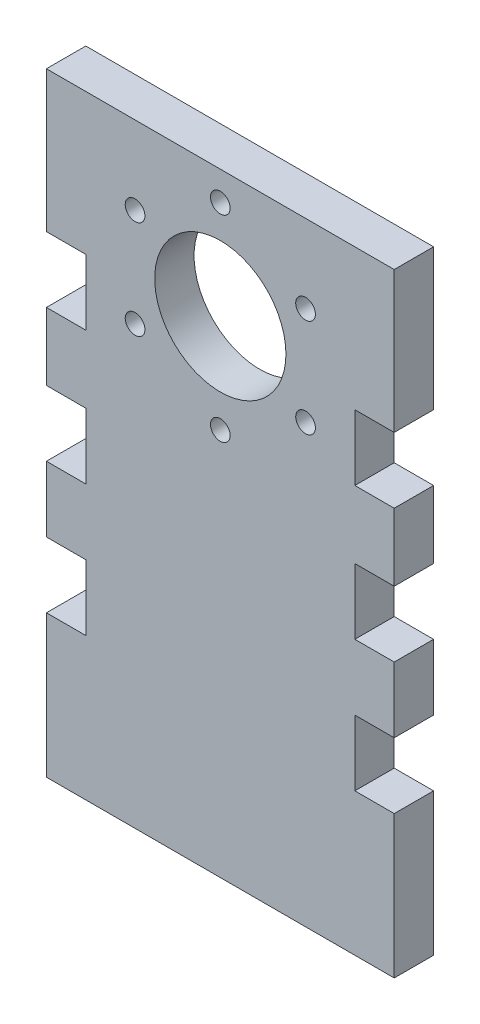
ISO-10303-21;
HEADER;
FILE_DESCRIPTION(('STEP AP214'),'2;1');
FILE_NAME('part.step','',(''),(''),'','','');
FILE_SCHEMA(('AUTOMOTIVE_DESIGN { 1 0 10303 214 1 1 1 1 }'));
ENDSEC;
DATA;
#1=APPLICATION_CONTEXT('core data for automotive mechanical design processes');
#2=APPLICATION_PROTOCOL_DEFINITION('international standard','automotive_design',2000,#1);
#3=PRODUCT_CONTEXT('',#1,'mechanical');
#4=PRODUCT('Part','Part','',(#3));
#5=PRODUCT_RELATED_PRODUCT_CATEGORY('part','',(#4));
#6=PRODUCT_DEFINITION_FORMATION('','',#4);
#7=PRODUCT_DEFINITION_CONTEXT('part definition',#1,'design');
#8=PRODUCT_DEFINITION('design','',#6,#7);
#9=PRODUCT_DEFINITION_SHAPE('','',#8);
#10=(LENGTH_UNIT() NAMED_UNIT(*) SI_UNIT(.MILLI.,.METRE.));
#11=(NAMED_UNIT(*) PLANE_ANGLE_UNIT() SI_UNIT($,.RADIAN.));
#12=(NAMED_UNIT(*) SI_UNIT($,.STERADIAN.) SOLID_ANGLE_UNIT());
#13=UNCERTAINTY_MEASURE_WITH_UNIT(LENGTH_MEASURE(1.E-05),#10,'distance_accuracy_value','');
#14=(GEOMETRIC_REPRESENTATION_CONTEXT(3) GLOBAL_UNCERTAINTY_ASSIGNED_CONTEXT((#13)) GLOBAL_UNIT_ASSIGNED_CONTEXT((#10,
#11,#12)) REPRESENTATION_CONTEXT('',''));
#15=CARTESIAN_POINT('',(0.,0.,0.));
#16=DIRECTION('',(0.,0.,1.));
#17=DIRECTION('',(1.,0.,0.));
#18=AXIS2_PLACEMENT_3D('',#15,#16,#17);
#19=CARTESIAN_POINT('',(0.,0.,3.));
#20=DIRECTION('',(0.,0.,1.));
#21=DIRECTION('',(1.,0.,0.));
#22=AXIS2_PLACEMENT_3D('',#19,#20,#21);
#23=PLANE('',#22);
#24=CARTESIAN_POINT('',(-6.49530237350616,12.7901937281074,3.));
#25=DIRECTION('',(0.,0.,1.));
#26=DIRECTION('',(1.,0.,0.));
#27=AXIS2_PLACEMENT_3D('',#24,#25,#26);
#28=CIRCLE('',#27,0.75);
#29=CARTESIAN_POINT('',(-5.74530237350616,12.7901937281074,3.));
#30=VERTEX_POINT('',#29);
#31=EDGE_CURVE('E513',#30,#30,#28,.T.);
#32=ORIENTED_EDGE('',*,*,#31,.F.);
#33=EDGE_LOOP('',(#32));
#34=FACE_BOUND('',#33,.T.);
#35=CARTESIAN_POINT('',(6.4951905283833,12.79,3.));
#36=DIRECTION('',(0.,0.,1.));
#37=DIRECTION('',(1.,0.,0.));
#38=AXIS2_PLACEMENT_3D('',#35,#36,#37);
#39=CIRCLE('',#38,0.750000000000005);
#40=CARTESIAN_POINT('',(7.2451905283833,12.79,3.));
#41=VERTEX_POINT('',#40);
#42=EDGE_CURVE('E525',#41,#41,#39,.T.);
#43=ORIENTED_EDGE('',*,*,#42,.F.);
#44=EDGE_LOOP('',(#43));
#45=FACE_BOUND('',#44,.T.);
#46=CARTESIAN_POINT('',(0.,24.04,3.));
#47=DIRECTION('',(0.,0.,1.));
#48=DIRECTION('',(1.,0.,0.));
#49=AXIS2_PLACEMENT_3D('',#46,#47,#48);
#50=CIRCLE('',#49,0.750000000000002);
#51=CARTESIAN_POINT('',(0.750000000000002,24.04,3.));
#52=VERTEX_POINT('',#51);
#53=EDGE_CURVE('E537',#52,#52,#50,.T.);
#54=ORIENTED_EDGE('',*,*,#53,.F.);
#55=EDGE_LOOP('',(#54));
#56=FACE_BOUND('',#55,.T.);
#57=DIRECTION('',(0.,1.,0.));
#58=VECTOR('',#57,1.);
#59=CARTESIAN_POINT('',(13.25,-9.65,3.));
#60=LINE('',#59,#58);
#61=CARTESIAN_POINT('',(13.25,-20.5,3.));
#62=VERTEX_POINT('',#61);
#63=CARTESIAN_POINT('',(13.25,-9.65,3.));
#64=VERTEX_POINT('',#63);
#65=EDGE_CURVE('E307',#62,#64,#60,.T.);
#66=ORIENTED_EDGE('',*,*,#65,.T.);
#67=DIRECTION('',(-1.,0.,0.));
#68=VECTOR('',#67,1.);
#69=CARTESIAN_POINT('',(10.25,-9.65000000000001,3.));
#70=LINE('',#69,#68);
#71=CARTESIAN_POINT('',(10.25,-9.65000000000001,3.));
#72=VERTEX_POINT('',#71);
#73=EDGE_CURVE('E153',#64,#72,#70,.T.);
#74=ORIENTED_EDGE('',*,*,#73,.T.);
#75=DIRECTION('',(0.,1.,0.));
#76=VECTOR('',#75,1.);
#77=CARTESIAN_POINT('',(10.25,-4.65,3.));
#78=LINE('',#77,#76);
#79=CARTESIAN_POINT('',(10.25,-4.65,3.));
#80=VERTEX_POINT('',#79);
#81=EDGE_CURVE('E382',#72,#80,#78,.T.);
#82=ORIENTED_EDGE('',*,*,#81,.T.);
#83=DIRECTION('',(1.,0.,0.));
#84=VECTOR('',#83,1.);
#85=CARTESIAN_POINT('',(13.25,-4.65,3.));
#86=LINE('',#85,#84);
#87=CARTESIAN_POINT('',(13.25,-4.65,3.));
#88=VERTEX_POINT('',#87);
#89=EDGE_CURVE('E401',#80,#88,#86,.T.);
#90=ORIENTED_EDGE('',*,*,#89,.T.);
#91=DIRECTION('',(0.,1.,0.));
#92=VECTOR('',#91,1.);
#93=CARTESIAN_POINT('',(13.25,0.349999999999997,3.));
#94=LINE('',#93,#92);
#95=CARTESIAN_POINT('',(13.25,0.349999999999997,3.));
#96=VERTEX_POINT('',#95);
#97=EDGE_CURVE('E398',#88,#96,#94,.T.);
#98=ORIENTED_EDGE('',*,*,#97,.T.);
#99=DIRECTION('',(-1.,0.,0.));
#100=VECTOR('',#99,1.);
#101=CARTESIAN_POINT('',(10.25,0.349999999999997,3.));
#102=LINE('',#101,#100);
#103=CARTESIAN_POINT('',(10.25,0.349999999999997,3.));
#104=VERTEX_POINT('',#103);
#105=EDGE_CURVE('E400',#96,#104,#102,.T.);
#106=ORIENTED_EDGE('',*,*,#105,.T.);
#107=DIRECTION('',(0.,1.,0.));
#108=VECTOR('',#107,1.);
#109=CARTESIAN_POINT('',(10.25,5.35,3.));
#110=LINE('',#109,#108);
#111=CARTESIAN_POINT('',(10.25,5.35,3.));
#112=VERTEX_POINT('',#111);
#113=EDGE_CURVE('E403',#104,#112,#110,.T.);
#114=ORIENTED_EDGE('',*,*,#113,.T.);
#115=DIRECTION('',(1.,0.,0.));
#116=VECTOR('',#115,1.);
#117=CARTESIAN_POINT('',(13.25,5.35,3.));
#118=LINE('',#117,#116);
#119=CARTESIAN_POINT('',(13.25,5.35,3.));
#120=VERTEX_POINT('',#119);
#121=EDGE_CURVE('E409',#112,#120,#118,.T.);
#122=ORIENTED_EDGE('',*,*,#121,.T.);
#123=DIRECTION('',(0.,1.,0.));
#124=VECTOR('',#123,1.);
#125=CARTESIAN_POINT('',(13.25,10.5,3.));
#126=LINE('',#125,#124);
#127=CARTESIAN_POINT('',(13.25,10.5,3.));
#128=VERTEX_POINT('',#127);
#129=EDGE_CURVE('E411',#120,#128,#126,.T.);
#130=ORIENTED_EDGE('',*,*,#129,.T.);
#131=DIRECTION('',(-1.,0.,0.));
#132=VECTOR('',#131,1.);
#133=CARTESIAN_POINT('',(10.25,10.5,3.));
#134=LINE('',#133,#132);
#135=CARTESIAN_POINT('',(10.25,10.5,3.));
#136=VERTEX_POINT('',#135);
#137=EDGE_CURVE('E413',#128,#136,#134,.T.);
#138=ORIENTED_EDGE('',*,*,#137,.T.);
#139=DIRECTION('',(0.,1.,0.));
#140=VECTOR('',#139,1.);
#141=CARTESIAN_POINT('',(10.25,15.5,3.));
#142=LINE('',#141,#140);
#143=CARTESIAN_POINT('',(10.25,15.5,3.));
#144=VERTEX_POINT('',#143);
#145=EDGE_CURVE('E415',#136,#144,#142,.T.);
#146=ORIENTED_EDGE('',*,*,#145,.T.);
#147=DIRECTION('',(1.,0.,0.));
#148=VECTOR('',#147,1.);
#149=CARTESIAN_POINT('',(13.25,15.5,3.));
#150=LINE('',#149,#148);
#151=CARTESIAN_POINT('',(13.25,15.5,3.));
#152=VERTEX_POINT('',#151);
#153=EDGE_CURVE('E417',#144,#152,#150,.T.);
#154=ORIENTED_EDGE('',*,*,#153,.T.);
#155=DIRECTION('',(0.,1.,0.));
#156=VECTOR('',#155,1.);
#157=CARTESIAN_POINT('',(13.25,20.5,3.));
#158=LINE('',#157,#156);
#159=CARTESIAN_POINT('',(13.25,26.25,3.));
#160=VERTEX_POINT('',#159);
#161=EDGE_CURVE('E419',#152,#160,#158,.T.);
#162=ORIENTED_EDGE('',*,*,#161,.T.);
#163=DIRECTION('',(-1.,0.,0.));
#164=VECTOR('',#163,1.);
#165=CARTESIAN_POINT('',(-13.25,26.25,3.));
#166=LINE('',#165,#164);
#167=CARTESIAN_POINT('',(-13.25,26.25,3.));
#168=VERTEX_POINT('',#167);
#169=EDGE_CURVE('E421',#160,#168,#166,.T.);
#170=ORIENTED_EDGE('',*,*,#169,.T.);
#171=DIRECTION('',(0.,-1.,0.));
#172=VECTOR('',#171,1.);
#173=CARTESIAN_POINT('',(-13.25,20.5,3.));
#174=LINE('',#173,#172);
#175=CARTESIAN_POINT('',(-13.25,15.5,3.));
#176=VERTEX_POINT('',#175);
#177=EDGE_CURVE('E423',#168,#176,#174,.T.);
#178=ORIENTED_EDGE('',*,*,#177,.T.);
#179=DIRECTION('',(1.,0.,0.));
#180=VECTOR('',#179,1.);
#181=CARTESIAN_POINT('',(-13.25,15.5,3.));
#182=LINE('',#181,#180);
#183=CARTESIAN_POINT('',(-10.25,15.5,3.));
#184=VERTEX_POINT('',#183);
#185=EDGE_CURVE('E425',#176,#184,#182,.T.);
#186=ORIENTED_EDGE('',*,*,#185,.T.);
#187=DIRECTION('',(0.,-1.,0.));
#188=VECTOR('',#187,1.);
#189=CARTESIAN_POINT('',(-10.25,15.5,3.));
#190=LINE('',#189,#188);
#191=CARTESIAN_POINT('',(-10.25,10.5,3.));
#192=VERTEX_POINT('',#191);
#193=EDGE_CURVE('E427',#184,#192,#190,.T.);
#194=ORIENTED_EDGE('',*,*,#193,.T.);
#195=DIRECTION('',(-1.,0.,0.));
#196=VECTOR('',#195,1.);
#197=CARTESIAN_POINT('',(-10.25,10.5,3.));
#198=LINE('',#197,#196);
#199=CARTESIAN_POINT('',(-13.25,10.5,3.));
#200=VERTEX_POINT('',#199);
#201=EDGE_CURVE('E429',#192,#200,#198,.T.);
#202=ORIENTED_EDGE('',*,*,#201,.T.);
#203=DIRECTION('',(0.,-1.,0.));
#204=VECTOR('',#203,1.);
#205=CARTESIAN_POINT('',(-13.25,10.5,3.));
#206=LINE('',#205,#204);
#207=CARTESIAN_POINT('',(-13.25,5.35,3.));
#208=VERTEX_POINT('',#207);
#209=EDGE_CURVE('E431',#200,#208,#206,.T.);
#210=ORIENTED_EDGE('',*,*,#209,.T.);
#211=DIRECTION('',(1.,0.,0.));
#212=VECTOR('',#211,1.);
#213=CARTESIAN_POINT('',(-13.25,5.35,3.));
#214=LINE('',#213,#212);
#215=CARTESIAN_POINT('',(-10.25,5.35,3.));
#216=VERTEX_POINT('',#215);
#217=EDGE_CURVE('E433',#208,#216,#214,.T.);
#218=ORIENTED_EDGE('',*,*,#217,.T.);
#219=DIRECTION('',(0.,-1.,0.));
#220=VECTOR('',#219,1.);
#221=CARTESIAN_POINT('',(-10.25,5.35,3.));
#222=LINE('',#221,#220);
#223=CARTESIAN_POINT('',(-10.25,0.349999999999994,3.));
#224=VERTEX_POINT('',#223);
#225=EDGE_CURVE('E435',#216,#224,#222,.T.);
#226=ORIENTED_EDGE('',*,*,#225,.T.);
#227=DIRECTION('',(-1.,0.,0.));
#228=VECTOR('',#227,1.);
#229=CARTESIAN_POINT('',(-10.25,0.349999999999994,3.));
#230=LINE('',#229,#228);
#231=CARTESIAN_POINT('',(-13.25,0.349999999999994,3.));
#232=VERTEX_POINT('',#231);
#233=EDGE_CURVE('E437',#224,#232,#230,.T.);
#234=ORIENTED_EDGE('',*,*,#233,.T.);
#235=DIRECTION('',(0.,-1.,0.));
#236=VECTOR('',#235,1.);
#237=CARTESIAN_POINT('',(-13.25,0.349999999999994,3.));
#238=LINE('',#237,#236);
#239=CARTESIAN_POINT('',(-13.25,-4.65000000000001,3.));
#240=VERTEX_POINT('',#239);
#241=EDGE_CURVE('E439',#232,#240,#238,.T.);
#242=ORIENTED_EDGE('',*,*,#241,.T.);
#243=DIRECTION('',(1.,0.,0.));
#244=VECTOR('',#243,1.);
#245=CARTESIAN_POINT('',(-13.25,-4.65000000000001,3.));
#246=LINE('',#245,#244);
#247=CARTESIAN_POINT('',(-10.25,-4.65000000000001,3.));
#248=VERTEX_POINT('',#247);
#249=EDGE_CURVE('E441',#240,#248,#246,.T.);
#250=ORIENTED_EDGE('',*,*,#249,.T.);
#251=DIRECTION('',(0.,-1.,0.));
#252=VECTOR('',#251,1.);
#253=CARTESIAN_POINT('',(-10.25,-4.65000000000001,3.));
#254=LINE('',#253,#252);
#255=CARTESIAN_POINT('',(-10.25,-9.65000000000001,3.));
#256=VERTEX_POINT('',#255);
#257=EDGE_CURVE('E232',#248,#256,#254,.T.);
#258=ORIENTED_EDGE('',*,*,#257,.T.);
#259=DIRECTION('',(-1.,0.,0.));
#260=VECTOR('',#259,1.);
#261=CARTESIAN_POINT('',(-10.25,-9.65000000000001,3.));
#262=LINE('',#261,#260);
#263=CARTESIAN_POINT('',(-13.25,-9.65000000000001,3.));
#264=VERTEX_POINT('',#263);
#265=EDGE_CURVE('E226',#256,#264,#262,.T.);
#266=ORIENTED_EDGE('',*,*,#265,.T.);
#267=DIRECTION('',(0.,-1.,0.));
#268=VECTOR('',#267,1.);
#269=CARTESIAN_POINT('',(-13.25,-9.65000000000001,3.));
#270=LINE('',#269,#268);
#271=CARTESIAN_POINT('',(-13.25,-20.5,3.));
#272=VERTEX_POINT('',#271);
#273=EDGE_CURVE('E230',#264,#272,#270,.T.);
#274=ORIENTED_EDGE('',*,*,#273,.T.);
#275=DIRECTION('',(1.,0.,0.));
#276=VECTOR('',#275,1.);
#277=CARTESIAN_POINT('',(-13.25,-20.5,3.));
#278=LINE('',#277,#276);
#279=EDGE_CURVE('E50',#272,#62,#278,.T.);
#280=ORIENTED_EDGE('',*,*,#279,.T.);
#281=EDGE_LOOP('',(#66,#74,#82,#90,#98,#106,#114,#122,#130,#138,#146,#154,#162,#170,#178,#186,
#194,#202,#210,#218,#226,#234,#242,#250,#258,#266,#274,#280));
#282=FACE_BOUND('',#281,.T.);
#283=CARTESIAN_POINT('',(0.,16.54,3.));
#284=DIRECTION('',(0.,0.,1.));
#285=DIRECTION('',(1.,0.,0.));
#286=AXIS2_PLACEMENT_3D('',#283,#284,#285);
#287=CIRCLE('',#286,5.);
#288=CARTESIAN_POINT('',(5.,16.54,3.));
#289=VERTEX_POINT('',#288);
#290=EDGE_CURVE('E254',#289,#289,#287,.T.);
#291=ORIENTED_EDGE('',*,*,#290,.F.);
#292=EDGE_LOOP('',(#291));
#293=FACE_BOUND('',#292,.T.);
#294=CARTESIAN_POINT('',(6.49530237350616,20.2898062718926,3.));
#295=DIRECTION('',(0.,0.,1.));
#296=DIRECTION('',(1.,0.,0.));
#297=AXIS2_PLACEMENT_3D('',#294,#295,#296);
#298=CIRCLE('',#297,0.750000000000002);
#299=CARTESIAN_POINT('',(7.24530237350616,20.2898062718926,3.));
#300=VERTEX_POINT('',#299);
#301=EDGE_CURVE('E531',#300,#300,#298,.T.);
#302=ORIENTED_EDGE('',*,*,#301,.F.);
#303=EDGE_LOOP('',(#302));
#304=FACE_BOUND('',#303,.T.);
#305=CARTESIAN_POINT('',(0.,9.03999999999999,3.));
#306=DIRECTION('',(0.,0.,1.));
#307=DIRECTION('',(1.,0.,0.));
#308=AXIS2_PLACEMENT_3D('',#305,#306,#307);
#309=CIRCLE('',#308,0.750000000000002);
#310=CARTESIAN_POINT('',(0.750000000000004,9.03999999999999,3.));
#311=VERTEX_POINT('',#310);
#312=EDGE_CURVE('E519',#311,#311,#309,.T.);
#313=ORIENTED_EDGE('',*,*,#312,.F.);
#314=EDGE_LOOP('',(#313));
#315=FACE_BOUND('',#314,.T.);
#316=CARTESIAN_POINT('',(-6.49519052838329,20.29,3.));
#317=DIRECTION('',(0.,0.,1.));
#318=DIRECTION('',(1.,0.,0.));
#319=AXIS2_PLACEMENT_3D('',#316,#317,#318);
#320=CIRCLE('',#319,0.750000000000002);
#321=CARTESIAN_POINT('',(-5.74519052838329,20.29,3.));
#322=VERTEX_POINT('',#321);
#323=EDGE_CURVE('E504',#322,#322,#320,.T.);
#324=ORIENTED_EDGE('',*,*,#323,.F.);
#325=EDGE_LOOP('',(#324));
#326=FACE_BOUND('',#325,.T.);
#327=ADVANCED_FACE('F33',(#34,#45,#56,#282,#293,#304,#315,#326),#23,.T.);
#328=CARTESIAN_POINT('',(0.,0.,0.));
#329=DIRECTION('',(0.,0.,1.));
#330=DIRECTION('',(1.,0.,0.));
#331=AXIS2_PLACEMENT_3D('',#328,#329,#330);
#332=PLANE('',#331);
#333=DIRECTION('',(0.,1.,0.));
#334=VECTOR('',#333,1.);
#335=CARTESIAN_POINT('',(13.25,-9.65,0.));
#336=LINE('',#335,#334);
#337=CARTESIAN_POINT('',(13.25,-20.5,0.));
#338=VERTEX_POINT('',#337);
#339=CARTESIAN_POINT('',(13.25,-9.65,0.));
#340=VERTEX_POINT('',#339);
#341=EDGE_CURVE('E250',#338,#340,#336,.T.);
#342=ORIENTED_EDGE('',*,*,#341,.F.);
#343=DIRECTION('',(1.,0.,0.));
#344=VECTOR('',#343,1.);
#345=CARTESIAN_POINT('',(-13.25,-20.5,0.));
#346=LINE('',#345,#344);
#347=CARTESIAN_POINT('',(-13.25,-20.5,0.));
#348=VERTEX_POINT('',#347);
#349=EDGE_CURVE('E145',#348,#338,#346,.T.);
#350=ORIENTED_EDGE('',*,*,#349,.F.);
#351=DIRECTION('',(0.,-1.,0.));
#352=VECTOR('',#351,1.);
#353=CARTESIAN_POINT('',(-13.25,-9.65000000000001,0.));
#354=LINE('',#353,#352);
#355=CARTESIAN_POINT('',(-13.25,-9.65000000000001,0.));
#356=VERTEX_POINT('',#355);
#357=EDGE_CURVE('E139',#356,#348,#354,.T.);
#358=ORIENTED_EDGE('',*,*,#357,.F.);
#359=DIRECTION('',(-1.,0.,0.));
#360=VECTOR('',#359,1.);
#361=CARTESIAN_POINT('',(-10.25,-9.65000000000001,0.));
#362=LINE('',#361,#360);
#363=CARTESIAN_POINT('',(-10.25,-9.65000000000001,0.));
#364=VERTEX_POINT('',#363);
#365=EDGE_CURVE('E240',#364,#356,#362,.T.);
#366=ORIENTED_EDGE('',*,*,#365,.F.);
#367=DIRECTION('',(0.,-1.,0.));
#368=VECTOR('',#367,1.);
#369=CARTESIAN_POINT('',(-10.25,-4.65000000000001,0.));
#370=LINE('',#369,#368);
#371=CARTESIAN_POINT('',(-10.25,-4.65000000000001,0.));
#372=VERTEX_POINT('',#371);
#373=EDGE_CURVE('E302',#372,#364,#370,.T.);
#374=ORIENTED_EDGE('',*,*,#373,.F.);
#375=DIRECTION('',(1.,0.,0.));
#376=VECTOR('',#375,1.);
#377=CARTESIAN_POINT('',(-13.25,-4.65000000000001,0.));
#378=LINE('',#377,#376);
#379=CARTESIAN_POINT('',(-13.25,-4.65000000000001,0.));
#380=VERTEX_POINT('',#379);
#381=EDGE_CURVE('E300',#380,#372,#378,.T.);
#382=ORIENTED_EDGE('',*,*,#381,.F.);
#383=DIRECTION('',(0.,-1.,0.));
#384=VECTOR('',#383,1.);
#385=CARTESIAN_POINT('',(-13.25,0.349999999999994,0.));
#386=LINE('',#385,#384);
#387=CARTESIAN_POINT('',(-13.25,0.349999999999994,0.));
#388=VERTEX_POINT('',#387);
#389=EDGE_CURVE('E298',#388,#380,#386,.T.);
#390=ORIENTED_EDGE('',*,*,#389,.F.);
#391=DIRECTION('',(-1.,0.,0.));
#392=VECTOR('',#391,1.);
#393=CARTESIAN_POINT('',(-10.25,0.349999999999994,0.));
#394=LINE('',#393,#392);
#395=CARTESIAN_POINT('',(-10.25,0.349999999999994,0.));
#396=VERTEX_POINT('',#395);
#397=EDGE_CURVE('E296',#396,#388,#394,.T.);
#398=ORIENTED_EDGE('',*,*,#397,.F.);
#399=DIRECTION('',(0.,-1.,0.));
#400=VECTOR('',#399,1.);
#401=CARTESIAN_POINT('',(-10.25,5.35,0.));
#402=LINE('',#401,#400);
#403=CARTESIAN_POINT('',(-10.25,5.35,0.));
#404=VERTEX_POINT('',#403);
#405=EDGE_CURVE('E294',#404,#396,#402,.T.);
#406=ORIENTED_EDGE('',*,*,#405,.F.);
#407=DIRECTION('',(1.,0.,0.));
#408=VECTOR('',#407,1.);
#409=CARTESIAN_POINT('',(-13.25,5.35,0.));
#410=LINE('',#409,#408);
#411=CARTESIAN_POINT('',(-13.25,5.35,0.));
#412=VERTEX_POINT('',#411);
#413=EDGE_CURVE('E292',#412,#404,#410,.T.);
#414=ORIENTED_EDGE('',*,*,#413,.F.);
#415=DIRECTION('',(0.,-1.,0.));
#416=VECTOR('',#415,1.);
#417=CARTESIAN_POINT('',(-13.25,10.5,0.));
#418=LINE('',#417,#416);
#419=CARTESIAN_POINT('',(-13.25,10.5,0.));
#420=VERTEX_POINT('',#419);
#421=EDGE_CURVE('E290',#420,#412,#418,.T.);
#422=ORIENTED_EDGE('',*,*,#421,.F.);
#423=DIRECTION('',(-1.,0.,0.));
#424=VECTOR('',#423,1.);
#425=CARTESIAN_POINT('',(-10.25,10.5,0.));
#426=LINE('',#425,#424);
#427=CARTESIAN_POINT('',(-10.25,10.5,0.));
#428=VERTEX_POINT('',#427);
#429=EDGE_CURVE('E288',#428,#420,#426,.T.);
#430=ORIENTED_EDGE('',*,*,#429,.F.);
#431=DIRECTION('',(0.,-1.,0.));
#432=VECTOR('',#431,1.);
#433=CARTESIAN_POINT('',(-10.25,15.5,0.));
#434=LINE('',#433,#432);
#435=CARTESIAN_POINT('',(-10.25,15.5,0.));
#436=VERTEX_POINT('',#435);
#437=EDGE_CURVE('E286',#436,#428,#434,.T.);
#438=ORIENTED_EDGE('',*,*,#437,.F.);
#439=DIRECTION('',(1.,0.,0.));
#440=VECTOR('',#439,1.);
#441=CARTESIAN_POINT('',(-13.25,15.5,0.));
#442=LINE('',#441,#440);
#443=CARTESIAN_POINT('',(-13.25,15.5,0.));
#444=VERTEX_POINT('',#443);
#445=EDGE_CURVE('E284',#444,#436,#442,.T.);
#446=ORIENTED_EDGE('',*,*,#445,.F.);
#447=DIRECTION('',(0.,-1.,0.));
#448=VECTOR('',#447,1.);
#449=CARTESIAN_POINT('',(-13.25,20.5,0.));
#450=LINE('',#449,#448);
#451=CARTESIAN_POINT('',(-13.25,26.25,0.));
#452=VERTEX_POINT('',#451);
#453=EDGE_CURVE('E282',#452,#444,#450,.T.);
#454=ORIENTED_EDGE('',*,*,#453,.F.);
#455=DIRECTION('',(-1.,0.,0.));
#456=VECTOR('',#455,1.);
#457=CARTESIAN_POINT('',(-13.25,26.25,0.));
#458=LINE('',#457,#456);
#459=CARTESIAN_POINT('',(13.25,26.25,0.));
#460=VERTEX_POINT('',#459);
#461=EDGE_CURVE('E279',#460,#452,#458,.T.);
#462=ORIENTED_EDGE('',*,*,#461,.F.);
#463=DIRECTION('',(0.,1.,0.));
#464=VECTOR('',#463,1.);
#465=CARTESIAN_POINT('',(13.25,26.25,0.));
#466=LINE('',#465,#464);
#467=CARTESIAN_POINT('',(13.25,15.5,0.));
#468=VERTEX_POINT('',#467);
#469=EDGE_CURVE('E277',#468,#460,#466,.T.);
#470=ORIENTED_EDGE('',*,*,#469,.F.);
#471=DIRECTION('',(1.,0.,0.));
#472=VECTOR('',#471,1.);
#473=CARTESIAN_POINT('',(13.25,15.5,0.));
#474=LINE('',#473,#472);
#475=CARTESIAN_POINT('',(10.25,15.5,0.));
#476=VERTEX_POINT('',#475);
#477=EDGE_CURVE('E274',#476,#468,#474,.T.);
#478=ORIENTED_EDGE('',*,*,#477,.F.);
#479=DIRECTION('',(0.,1.,0.));
#480=VECTOR('',#479,1.);
#481=CARTESIAN_POINT('',(10.25,15.5,0.));
#482=LINE('',#481,#480);
#483=CARTESIAN_POINT('',(10.25,10.5,0.));
#484=VERTEX_POINT('',#483);
#485=EDGE_CURVE('E272',#484,#476,#482,.T.);
#486=ORIENTED_EDGE('',*,*,#485,.F.);
#487=DIRECTION('',(-1.,0.,0.));
#488=VECTOR('',#487,1.);
#489=CARTESIAN_POINT('',(10.25,10.5,0.));
#490=LINE('',#489,#488);
#491=CARTESIAN_POINT('',(13.25,10.5,0.));
#492=VERTEX_POINT('',#491);
#493=EDGE_CURVE('E270',#492,#484,#490,.T.);
#494=ORIENTED_EDGE('',*,*,#493,.F.);
#495=DIRECTION('',(0.,1.,0.));
#496=VECTOR('',#495,1.);
#497=CARTESIAN_POINT('',(13.25,10.5,0.));
#498=LINE('',#497,#496);
#499=CARTESIAN_POINT('',(13.25,5.35,0.));
#500=VERTEX_POINT('',#499);
#501=EDGE_CURVE('E268',#500,#492,#498,.T.);
#502=ORIENTED_EDGE('',*,*,#501,.F.);
#503=DIRECTION('',(1.,0.,0.));
#504=VECTOR('',#503,1.);
#505=CARTESIAN_POINT('',(13.25,5.35,0.));
#506=LINE('',#505,#504);
#507=CARTESIAN_POINT('',(10.25,5.35,0.));
#508=VERTEX_POINT('',#507);
#509=EDGE_CURVE('E266',#508,#500,#506,.T.);
#510=ORIENTED_EDGE('',*,*,#509,.F.);
#511=DIRECTION('',(0.,1.,0.));
#512=VECTOR('',#511,1.);
#513=CARTESIAN_POINT('',(10.25,5.35,0.));
#514=LINE('',#513,#512);
#515=CARTESIAN_POINT('',(10.25,0.349999999999997,0.));
#516=VERTEX_POINT('',#515);
#517=EDGE_CURVE('E264',#516,#508,#514,.T.);
#518=ORIENTED_EDGE('',*,*,#517,.F.);
#519=DIRECTION('',(-1.,0.,0.));
#520=VECTOR('',#519,1.);
#521=CARTESIAN_POINT('',(10.25,0.349999999999997,0.));
#522=LINE('',#521,#520);
#523=CARTESIAN_POINT('',(13.25,0.349999999999997,0.));
#524=VERTEX_POINT('',#523);
#525=EDGE_CURVE('E262',#524,#516,#522,.T.);
#526=ORIENTED_EDGE('',*,*,#525,.F.);
#527=DIRECTION('',(0.,1.,0.));
#528=VECTOR('',#527,1.);
#529=CARTESIAN_POINT('',(13.25,0.349999999999997,0.));
#530=LINE('',#529,#528);
#531=CARTESIAN_POINT('',(13.25,-4.65,0.));
#532=VERTEX_POINT('',#531);
#533=EDGE_CURVE('E260',#532,#524,#530,.T.);
#534=ORIENTED_EDGE('',*,*,#533,.F.);
#535=DIRECTION('',(1.,0.,0.));
#536=VECTOR('',#535,1.);
#537=CARTESIAN_POINT('',(13.25,-4.65,0.));
#538=LINE('',#537,#536);
#539=CARTESIAN_POINT('',(10.25,-4.65,0.));
#540=VERTEX_POINT('',#539);
#541=EDGE_CURVE('E258',#540,#532,#538,.T.);
#542=ORIENTED_EDGE('',*,*,#541,.F.);
#543=DIRECTION('',(0.,1.,0.));
#544=VECTOR('',#543,1.);
#545=CARTESIAN_POINT('',(10.25,-4.65,0.));
#546=LINE('',#545,#544);
#547=CARTESIAN_POINT('',(10.25,-9.65000000000001,0.));
#548=VERTEX_POINT('',#547);
#549=EDGE_CURVE('E256',#548,#540,#546,.T.);
#550=ORIENTED_EDGE('',*,*,#549,.F.);
#551=DIRECTION('',(-1.,0.,0.));
#552=VECTOR('',#551,1.);
#553=CARTESIAN_POINT('',(10.25,-9.65000000000001,0.));
#554=LINE('',#553,#552);
#555=EDGE_CURVE('E253',#340,#548,#554,.T.);
#556=ORIENTED_EDGE('',*,*,#555,.F.);
#557=EDGE_LOOP('',(#342,#350,#358,#366,#374,#382,#390,#398,#406,#414,#422,#430,#438,#446,#454,
#462,#470,#478,#486,#494,#502,#510,#518,#526,#534,#542,#550,#556));
#558=FACE_BOUND('',#557,.T.);
#559=CARTESIAN_POINT('',(0.,16.54,0.));
#560=DIRECTION('',(0.,0.,1.));
#561=DIRECTION('',(1.,0.,0.));
#562=AXIS2_PLACEMENT_3D('',#559,#560,#561);
#563=CIRCLE('',#562,5.);
#564=CARTESIAN_POINT('',(5.,16.54,0.));
#565=VERTEX_POINT('',#564);
#566=EDGE_CURVE('E540',#565,#565,#563,.T.);
#567=ORIENTED_EDGE('',*,*,#566,.T.);
#568=EDGE_LOOP('',(#567));
#569=FACE_BOUND('',#568,.T.);
#570=CARTESIAN_POINT('',(0.,24.04,0.));
#571=DIRECTION('',(0.,0.,1.));
#572=DIRECTION('',(1.,0.,0.));
#573=AXIS2_PLACEMENT_3D('',#570,#571,#572);
#574=CIRCLE('',#573,0.750000000000002);
#575=CARTESIAN_POINT('',(0.750000000000002,24.04,0.));
#576=VERTEX_POINT('',#575);
#577=EDGE_CURVE('E534',#576,#576,#574,.T.);
#578=ORIENTED_EDGE('',*,*,#577,.T.);
#579=EDGE_LOOP('',(#578));
#580=FACE_BOUND('',#579,.T.);
#581=CARTESIAN_POINT('',(6.49530237350616,20.2898062718926,0.));
#582=DIRECTION('',(0.,0.,1.));
#583=DIRECTION('',(1.,0.,0.));
#584=AXIS2_PLACEMENT_3D('',#581,#582,#583);
#585=CIRCLE('',#584,0.750000000000002);
#586=CARTESIAN_POINT('',(7.24530237350616,20.2898062718926,0.));
#587=VERTEX_POINT('',#586);
#588=EDGE_CURVE('E528',#587,#587,#585,.T.);
#589=ORIENTED_EDGE('',*,*,#588,.T.);
#590=EDGE_LOOP('',(#589));
#591=FACE_BOUND('',#590,.T.);
#592=CARTESIAN_POINT('',(6.4951905283833,12.79,0.));
#593=DIRECTION('',(0.,0.,1.));
#594=DIRECTION('',(1.,0.,0.));
#595=AXIS2_PLACEMENT_3D('',#592,#593,#594);
#596=CIRCLE('',#595,0.750000000000005);
#597=CARTESIAN_POINT('',(7.2451905283833,12.79,0.));
#598=VERTEX_POINT('',#597);
#599=EDGE_CURVE('E522',#598,#598,#596,.T.);
#600=ORIENTED_EDGE('',*,*,#599,.T.);
#601=EDGE_LOOP('',(#600));
#602=FACE_BOUND('',#601,.T.);
#603=CARTESIAN_POINT('',(0.,9.03999999999999,0.));
#604=DIRECTION('',(0.,0.,1.));
#605=DIRECTION('',(1.,0.,0.));
#606=AXIS2_PLACEMENT_3D('',#603,#604,#605);
#607=CIRCLE('',#606,0.750000000000002);
#608=CARTESIAN_POINT('',(0.750000000000004,9.03999999999999,0.));
#609=VERTEX_POINT('',#608);
#610=EDGE_CURVE('E516',#609,#609,#607,.T.);
#611=ORIENTED_EDGE('',*,*,#610,.T.);
#612=EDGE_LOOP('',(#611));
#613=FACE_BOUND('',#612,.T.);
#614=CARTESIAN_POINT('',(-6.49530237350616,12.7901937281074,0.));
#615=DIRECTION('',(0.,0.,1.));
#616=DIRECTION('',(1.,0.,0.));
#617=AXIS2_PLACEMENT_3D('',#614,#615,#616);
#618=CIRCLE('',#617,0.75);
#619=CARTESIAN_POINT('',(-5.74530237350616,12.7901937281074,0.));
#620=VERTEX_POINT('',#619);
#621=EDGE_CURVE('E510',#620,#620,#618,.T.);
#622=ORIENTED_EDGE('',*,*,#621,.T.);
#623=EDGE_LOOP('',(#622));
#624=FACE_BOUND('',#623,.T.);
#625=CARTESIAN_POINT('',(-6.49519052838329,20.29,0.));
#626=DIRECTION('',(0.,0.,1.));
#627=DIRECTION('',(1.,0.,0.));
#628=AXIS2_PLACEMENT_3D('',#625,#626,#627);
#629=CIRCLE('',#628,0.750000000000002);
#630=CARTESIAN_POINT('',(-5.74519052838329,20.29,0.));
#631=VERTEX_POINT('',#630);
#632=EDGE_CURVE('E507',#631,#631,#629,.T.);
#633=ORIENTED_EDGE('',*,*,#632,.T.);
#634=EDGE_LOOP('',(#633));
#635=FACE_BOUND('',#634,.T.);
#636=ADVANCED_FACE('F386',(#558,#569,#580,#591,#602,#613,#624,#635),#332,.F.);
#637=CARTESIAN_POINT('',(13.25,-9.65,3.));
#638=DIRECTION('',(-1.,0.,0.));
#639=DIRECTION('',(0.,0.,1.));
#640=AXIS2_PLACEMENT_3D('',#637,#638,#639);
#641=PLANE('',#640);
#642=ORIENTED_EDGE('',*,*,#341,.T.);
#643=DIRECTION('',(0.,0.,-1.));
#644=VECTOR('',#643,1.);
#645=CARTESIAN_POINT('',(13.25,-9.65,3.));
#646=LINE('',#645,#644);
#647=EDGE_CURVE('E11',#64,#340,#646,.T.);
#648=ORIENTED_EDGE('',*,*,#647,.F.);
#649=ORIENTED_EDGE('',*,*,#65,.F.);
#650=DIRECTION('',(0.,0.,-1.));
#651=VECTOR('',#650,1.);
#652=CARTESIAN_POINT('',(13.25,-20.5,3.));
#653=LINE('',#652,#651);
#654=EDGE_CURVE('E246',#62,#338,#653,.T.);
#655=ORIENTED_EDGE('',*,*,#654,.T.);
#656=EDGE_LOOP('',(#642,#648,#649,#655));
#657=FACE_BOUND('',#656,.T.);
#658=ADVANCED_FACE('F35',(#657),#641,.F.);
#659=CARTESIAN_POINT('',(10.25,-9.65000000000001,3.));
#660=DIRECTION('',(0.,-1.,0.));
#661=DIRECTION('',(1.,0.,0.));
#662=AXIS2_PLACEMENT_3D('',#659,#660,#661);
#663=PLANE('',#662);
#664=ORIENTED_EDGE('',*,*,#555,.T.);
#665=DIRECTION('',(0.,0.,-1.));
#666=VECTOR('',#665,1.);
#667=CARTESIAN_POINT('',(10.25,-9.65000000000001,3.));
#668=LINE('',#667,#666);
#669=EDGE_CURVE('E42',#72,#548,#668,.T.);
#670=ORIENTED_EDGE('',*,*,#669,.F.);
#671=ORIENTED_EDGE('',*,*,#73,.F.);
#672=ORIENTED_EDGE('',*,*,#647,.T.);
#673=EDGE_LOOP('',(#664,#670,#671,#672));
#674=FACE_BOUND('',#673,.T.);
#675=ADVANCED_FACE('F839',(#674),#663,.F.);
#676=CARTESIAN_POINT('',(10.25,-4.65,3.));
#677=DIRECTION('',(-1.,0.,0.));
#678=DIRECTION('',(0.,0.,1.));
#679=AXIS2_PLACEMENT_3D('',#676,#677,#678);
#680=PLANE('',#679);
#681=ORIENTED_EDGE('',*,*,#549,.T.);
#682=DIRECTION('',(0.,0.,-1.));
#683=VECTOR('',#682,1.);
#684=CARTESIAN_POINT('',(10.25,-4.65,3.));
#685=LINE('',#684,#683);
#686=EDGE_CURVE('E374',#80,#540,#685,.T.);
#687=ORIENTED_EDGE('',*,*,#686,.F.);
#688=ORIENTED_EDGE('',*,*,#81,.F.);
#689=ORIENTED_EDGE('',*,*,#669,.T.);
#690=EDGE_LOOP('',(#681,#687,#688,#689));
#691=FACE_BOUND('',#690,.T.);
#692=ADVANCED_FACE('F380',(#691),#680,.F.);
#693=CARTESIAN_POINT('',(13.25,-4.65,3.));
#694=DIRECTION('',(0.,1.,0.));
#695=DIRECTION('',(-1.,0.,0.));
#696=AXIS2_PLACEMENT_3D('',#693,#694,#695);
#697=PLANE('',#696);
#698=ORIENTED_EDGE('',*,*,#541,.T.);
#699=DIRECTION('',(0.,0.,-1.));
#700=VECTOR('',#699,1.);
#701=CARTESIAN_POINT('',(13.25,-4.65,3.));
#702=LINE('',#701,#700);
#703=EDGE_CURVE('E371',#88,#532,#702,.T.);
#704=ORIENTED_EDGE('',*,*,#703,.F.);
#705=ORIENTED_EDGE('',*,*,#89,.F.);
#706=ORIENTED_EDGE('',*,*,#686,.T.);
#707=EDGE_LOOP('',(#698,#704,#705,#706));
#708=FACE_BOUND('',#707,.T.);
#709=ADVANCED_FACE('F392',(#708),#697,.F.);
#710=CARTESIAN_POINT('',(13.25,0.349999999999997,3.));
#711=DIRECTION('',(-1.,0.,0.));
#712=DIRECTION('',(0.,-1.,0.));
#713=AXIS2_PLACEMENT_3D('',#710,#711,#712);
#714=PLANE('',#713);
#715=ORIENTED_EDGE('',*,*,#533,.T.);
#716=DIRECTION('',(0.,0.,-1.));
#717=VECTOR('',#716,1.);
#718=CARTESIAN_POINT('',(13.25,0.349999999999997,3.));
#719=LINE('',#718,#717);
#720=EDGE_CURVE('E368',#96,#524,#719,.T.);
#721=ORIENTED_EDGE('',*,*,#720,.F.);
#722=ORIENTED_EDGE('',*,*,#97,.F.);
#723=ORIENTED_EDGE('',*,*,#703,.T.);
#724=EDGE_LOOP('',(#715,#721,#722,#723));
#725=FACE_BOUND('',#724,.T.);
#726=ADVANCED_FACE('F396',(#725),#714,.F.);
#727=CARTESIAN_POINT('',(10.25,0.349999999999997,3.));
#728=DIRECTION('',(0.,-1.,0.));
#729=DIRECTION('',(1.,0.,0.));
#730=AXIS2_PLACEMENT_3D('',#727,#728,#729);
#731=PLANE('',#730);
#732=ORIENTED_EDGE('',*,*,#525,.T.);
#733=DIRECTION('',(0.,0.,-1.));
#734=VECTOR('',#733,1.);
#735=CARTESIAN_POINT('',(10.25,0.349999999999997,3.));
#736=LINE('',#735,#734);
#737=EDGE_CURVE('E365',#104,#516,#736,.T.);
#738=ORIENTED_EDGE('',*,*,#737,.F.);
#739=ORIENTED_EDGE('',*,*,#105,.F.);
#740=ORIENTED_EDGE('',*,*,#720,.T.);
#741=EDGE_LOOP('',(#732,#738,#739,#740));
#742=FACE_BOUND('',#741,.T.);
#743=ADVANCED_FACE('F804',(#742),#731,.F.);
#744=CARTESIAN_POINT('',(10.25,5.35,3.));
#745=DIRECTION('',(-1.,0.,0.));
#746=DIRECTION('',(0.,-1.,0.));
#747=AXIS2_PLACEMENT_3D('',#744,#745,#746);
#748=PLANE('',#747);
#749=ORIENTED_EDGE('',*,*,#517,.T.);
#750=DIRECTION('',(0.,0.,-1.));
#751=VECTOR('',#750,1.);
#752=CARTESIAN_POINT('',(10.25,5.35,3.));
#753=LINE('',#752,#751);
#754=EDGE_CURVE('E362',#112,#508,#753,.T.);
#755=ORIENTED_EDGE('',*,*,#754,.F.);
#756=ORIENTED_EDGE('',*,*,#113,.F.);
#757=ORIENTED_EDGE('',*,*,#737,.T.);
#758=EDGE_LOOP('',(#749,#755,#756,#757));
#759=FACE_BOUND('',#758,.T.);
#760=ADVANCED_FACE('F794',(#759),#748,.F.);
#761=CARTESIAN_POINT('',(13.25,5.35,3.));
#762=DIRECTION('',(0.,1.,0.));
#763=DIRECTION('',(-1.,0.,0.));
#764=AXIS2_PLACEMENT_3D('',#761,#762,#763);
#765=PLANE('',#764);
#766=ORIENTED_EDGE('',*,*,#509,.T.);
#767=DIRECTION('',(0.,0.,-1.));
#768=VECTOR('',#767,1.);
#769=CARTESIAN_POINT('',(13.25,5.35,3.));
#770=LINE('',#769,#768);
#771=EDGE_CURVE('E359',#120,#500,#770,.T.);
#772=ORIENTED_EDGE('',*,*,#771,.F.);
#773=ORIENTED_EDGE('',*,*,#121,.F.);
#774=ORIENTED_EDGE('',*,*,#754,.T.);
#775=EDGE_LOOP('',(#766,#772,#773,#774));
#776=FACE_BOUND('',#775,.T.);
#777=ADVANCED_FACE('F784',(#776),#765,.F.);
#778=CARTESIAN_POINT('',(13.25,10.5,3.));
#779=DIRECTION('',(-1.,0.,0.));
#780=DIRECTION('',(0.,0.,1.));
#781=AXIS2_PLACEMENT_3D('',#778,#779,#780);
#782=PLANE('',#781);
#783=ORIENTED_EDGE('',*,*,#501,.T.);
#784=DIRECTION('',(0.,0.,-1.));
#785=VECTOR('',#784,1.);
#786=CARTESIAN_POINT('',(13.25,10.5,3.));
#787=LINE('',#786,#785);
#788=EDGE_CURVE('E356',#128,#492,#787,.T.);
#789=ORIENTED_EDGE('',*,*,#788,.F.);
#790=ORIENTED_EDGE('',*,*,#129,.F.);
#791=ORIENTED_EDGE('',*,*,#771,.T.);
#792=EDGE_LOOP('',(#783,#789,#790,#791));
#793=FACE_BOUND('',#792,.T.);
#794=ADVANCED_FACE('F774',(#793),#782,.F.);
#795=CARTESIAN_POINT('',(10.25,10.5,3.));
#796=DIRECTION('',(0.,-1.,0.));
#797=DIRECTION('',(1.,0.,0.));
#798=AXIS2_PLACEMENT_3D('',#795,#796,#797);
#799=PLANE('',#798);
#800=ORIENTED_EDGE('',*,*,#493,.T.);
#801=DIRECTION('',(0.,0.,-1.));
#802=VECTOR('',#801,1.);
#803=CARTESIAN_POINT('',(10.25,10.5,3.));
#804=LINE('',#803,#802);
#805=EDGE_CURVE('E353',#136,#484,#804,.T.);
#806=ORIENTED_EDGE('',*,*,#805,.F.);
#807=ORIENTED_EDGE('',*,*,#137,.F.);
#808=ORIENTED_EDGE('',*,*,#788,.T.);
#809=EDGE_LOOP('',(#800,#806,#807,#808));
#810=FACE_BOUND('',#809,.T.);
#811=ADVANCED_FACE('F764',(#810),#799,.F.);
#812=CARTESIAN_POINT('',(10.25,15.5,3.));
#813=DIRECTION('',(-1.,0.,0.));
#814=DIRECTION('',(0.,-1.,0.));
#815=AXIS2_PLACEMENT_3D('',#812,#813,#814);
#816=PLANE('',#815);
#817=ORIENTED_EDGE('',*,*,#485,.T.);
#818=DIRECTION('',(0.,0.,-1.));
#819=VECTOR('',#818,1.);
#820=CARTESIAN_POINT('',(10.25,15.5,3.));
#821=LINE('',#820,#819);
#822=EDGE_CURVE('E350',#144,#476,#821,.T.);
#823=ORIENTED_EDGE('',*,*,#822,.F.);
#824=ORIENTED_EDGE('',*,*,#145,.F.);
#825=ORIENTED_EDGE('',*,*,#805,.T.);
#826=EDGE_LOOP('',(#817,#823,#824,#825));
#827=FACE_BOUND('',#826,.T.);
#828=ADVANCED_FACE('F754',(#827),#816,.F.);
#829=CARTESIAN_POINT('',(13.25,15.5,3.));
#830=DIRECTION('',(0.,1.,0.));
#831=DIRECTION('',(-1.,0.,0.));
#832=AXIS2_PLACEMENT_3D('',#829,#830,#831);
#833=PLANE('',#832);
#834=ORIENTED_EDGE('',*,*,#477,.T.);
#835=DIRECTION('',(0.,0.,-1.));
#836=VECTOR('',#835,1.);
#837=CARTESIAN_POINT('',(13.25,15.5,3.));
#838=LINE('',#837,#836);
#839=EDGE_CURVE('E347',#152,#468,#838,.T.);
#840=ORIENTED_EDGE('',*,*,#839,.F.);
#841=ORIENTED_EDGE('',*,*,#153,.F.);
#842=ORIENTED_EDGE('',*,*,#822,.T.);
#843=EDGE_LOOP('',(#834,#840,#841,#842));
#844=FACE_BOUND('',#843,.T.);
#845=ADVANCED_FACE('F743',(#844),#833,.F.);
#846=CARTESIAN_POINT('',(13.25,26.25,3.));
#847=DIRECTION('',(-1.,0.,0.));
#848=DIRECTION('',(0.,0.,1.));
#849=AXIS2_PLACEMENT_3D('',#846,#847,#848);
#850=PLANE('',#849);
#851=ORIENTED_EDGE('',*,*,#469,.T.);
#852=DIRECTION('',(0.,0.,-1.));
#853=VECTOR('',#852,1.);
#854=CARTESIAN_POINT('',(13.25,26.25,3.));
#855=LINE('',#854,#853);
#856=EDGE_CURVE('E344',#160,#460,#855,.T.);
#857=ORIENTED_EDGE('',*,*,#856,.F.);
#858=ORIENTED_EDGE('',*,*,#161,.F.);
#859=ORIENTED_EDGE('',*,*,#839,.T.);
#860=EDGE_LOOP('',(#851,#857,#858,#859));
#861=FACE_BOUND('',#860,.T.);
#862=ADVANCED_FACE('F733',(#861),#850,.F.);
#863=CARTESIAN_POINT('',(-13.25,26.25,3.));
#864=DIRECTION('',(0.,-1.,0.));
#865=DIRECTION('',(1.,0.,0.));
#866=AXIS2_PLACEMENT_3D('',#863,#864,#865);
#867=PLANE('',#866);
#868=ORIENTED_EDGE('',*,*,#461,.T.);
#869=DIRECTION('',(0.,0.,-1.));
#870=VECTOR('',#869,1.);
#871=CARTESIAN_POINT('',(-13.25,26.25,3.));
#872=LINE('',#871,#870);
#873=EDGE_CURVE('E341',#168,#452,#872,.T.);
#874=ORIENTED_EDGE('',*,*,#873,.F.);
#875=ORIENTED_EDGE('',*,*,#169,.F.);
#876=ORIENTED_EDGE('',*,*,#856,.T.);
#877=EDGE_LOOP('',(#868,#874,#875,#876));
#878=FACE_BOUND('',#877,.T.);
#879=ADVANCED_FACE('F722',(#878),#867,.F.);
#880=CARTESIAN_POINT('',(-13.25,20.5,3.));
#881=DIRECTION('',(1.,0.,0.));
#882=DIRECTION('',(0.,0.,-1.));
#883=AXIS2_PLACEMENT_3D('',#880,#881,#882);
#884=PLANE('',#883);
#885=ORIENTED_EDGE('',*,*,#453,.T.);
#886=DIRECTION('',(0.,0.,-1.));
#887=VECTOR('',#886,1.);
#888=CARTESIAN_POINT('',(-13.25,15.5,3.));
#889=LINE('',#888,#887);
#890=EDGE_CURVE('E338',#176,#444,#889,.T.);
#891=ORIENTED_EDGE('',*,*,#890,.F.);
#892=ORIENTED_EDGE('',*,*,#177,.F.);
#893=ORIENTED_EDGE('',*,*,#873,.T.);
#894=EDGE_LOOP('',(#885,#891,#892,#893));
#895=FACE_BOUND('',#894,.T.);
#896=ADVANCED_FACE('F712',(#895),#884,.F.);
#897=CARTESIAN_POINT('',(-13.25,15.5,3.));
#898=DIRECTION('',(0.,1.,0.));
#899=DIRECTION('',(0.,0.,1.));
#900=AXIS2_PLACEMENT_3D('',#897,#898,#899);
#901=PLANE('',#900);
#902=ORIENTED_EDGE('',*,*,#445,.T.);
#903=DIRECTION('',(0.,0.,-1.));
#904=VECTOR('',#903,1.);
#905=CARTESIAN_POINT('',(-10.25,15.5,3.));
#906=LINE('',#905,#904);
#907=EDGE_CURVE('E335',#184,#436,#906,.T.);
#908=ORIENTED_EDGE('',*,*,#907,.F.);
#909=ORIENTED_EDGE('',*,*,#185,.F.);
#910=ORIENTED_EDGE('',*,*,#890,.T.);
#911=EDGE_LOOP('',(#902,#908,#909,#910));
#912=FACE_BOUND('',#911,.T.);
#913=ADVANCED_FACE('F702',(#912),#901,.F.);
#914=CARTESIAN_POINT('',(-10.25,15.5,3.));
#915=DIRECTION('',(1.,0.,0.));
#916=DIRECTION('',(0.,0.,-1.));
#917=AXIS2_PLACEMENT_3D('',#914,#915,#916);
#918=PLANE('',#917);
#919=ORIENTED_EDGE('',*,*,#437,.T.);
#920=DIRECTION('',(0.,0.,-1.));
#921=VECTOR('',#920,1.);
#922=CARTESIAN_POINT('',(-10.25,10.5,3.));
#923=LINE('',#922,#921);
#924=EDGE_CURVE('E332',#192,#428,#923,.T.);
#925=ORIENTED_EDGE('',*,*,#924,.F.);
#926=ORIENTED_EDGE('',*,*,#193,.F.);
#927=ORIENTED_EDGE('',*,*,#907,.T.);
#928=EDGE_LOOP('',(#919,#925,#926,#927));
#929=FACE_BOUND('',#928,.T.);
#930=ADVANCED_FACE('F692',(#929),#918,.F.);
#931=CARTESIAN_POINT('',(-10.25,10.5,3.));
#932=DIRECTION('',(0.,-1.,0.));
#933=DIRECTION('',(0.,0.,-1.));
#934=AXIS2_PLACEMENT_3D('',#931,#932,#933);
#935=PLANE('',#934);
#936=ORIENTED_EDGE('',*,*,#429,.T.);
#937=DIRECTION('',(0.,0.,-1.));
#938=VECTOR('',#937,1.);
#939=CARTESIAN_POINT('',(-13.25,10.5,3.));
#940=LINE('',#939,#938);
#941=EDGE_CURVE('E329',#200,#420,#940,.T.);
#942=ORIENTED_EDGE('',*,*,#941,.F.);
#943=ORIENTED_EDGE('',*,*,#201,.F.);
#944=ORIENTED_EDGE('',*,*,#924,.T.);
#945=EDGE_LOOP('',(#936,#942,#943,#944));
#946=FACE_BOUND('',#945,.T.);
#947=ADVANCED_FACE('F682',(#946),#935,.F.);
#948=CARTESIAN_POINT('',(-13.25,10.5,3.));
#949=DIRECTION('',(1.,0.,0.));
#950=DIRECTION('',(0.,0.,-1.));
#951=AXIS2_PLACEMENT_3D('',#948,#949,#950);
#952=PLANE('',#951);
#953=ORIENTED_EDGE('',*,*,#421,.T.);
#954=DIRECTION('',(0.,0.,-1.));
#955=VECTOR('',#954,1.);
#956=CARTESIAN_POINT('',(-13.25,5.35,3.));
#957=LINE('',#956,#955);
#958=EDGE_CURVE('E326',#208,#412,#957,.T.);
#959=ORIENTED_EDGE('',*,*,#958,.F.);
#960=ORIENTED_EDGE('',*,*,#209,.F.);
#961=ORIENTED_EDGE('',*,*,#941,.T.);
#962=EDGE_LOOP('',(#953,#959,#960,#961));
#963=FACE_BOUND('',#962,.T.);
#964=ADVANCED_FACE('F672',(#963),#952,.F.);
#965=CARTESIAN_POINT('',(-13.25,5.35,3.));
#966=DIRECTION('',(0.,1.,0.));
#967=DIRECTION('',(0.,0.,1.));
#968=AXIS2_PLACEMENT_3D('',#965,#966,#967);
#969=PLANE('',#968);
#970=ORIENTED_EDGE('',*,*,#413,.T.);
#971=DIRECTION('',(0.,0.,-1.));
#972=VECTOR('',#971,1.);
#973=CARTESIAN_POINT('',(-10.25,5.35,3.));
#974=LINE('',#973,#972);
#975=EDGE_CURVE('E323',#216,#404,#974,.T.);
#976=ORIENTED_EDGE('',*,*,#975,.F.);
#977=ORIENTED_EDGE('',*,*,#217,.F.);
#978=ORIENTED_EDGE('',*,*,#958,.T.);
#979=EDGE_LOOP('',(#970,#976,#977,#978));
#980=FACE_BOUND('',#979,.T.);
#981=ADVANCED_FACE('F662',(#980),#969,.F.);
#982=CARTESIAN_POINT('',(-10.25,5.35,3.));
#983=DIRECTION('',(1.,0.,0.));
#984=DIRECTION('',(0.,1.,0.));
#985=AXIS2_PLACEMENT_3D('',#982,#983,#984);
#986=PLANE('',#985);
#987=ORIENTED_EDGE('',*,*,#405,.T.);
#988=DIRECTION('',(0.,0.,-1.));
#989=VECTOR('',#988,1.);
#990=CARTESIAN_POINT('',(-10.25,0.349999999999994,3.));
#991=LINE('',#990,#989);
#992=EDGE_CURVE('E320',#224,#396,#991,.T.);
#993=ORIENTED_EDGE('',*,*,#992,.F.);
#994=ORIENTED_EDGE('',*,*,#225,.F.);
#995=ORIENTED_EDGE('',*,*,#975,.T.);
#996=EDGE_LOOP('',(#987,#993,#994,#995));
#997=FACE_BOUND('',#996,.T.);
#998=ADVANCED_FACE('F652',(#997),#986,.F.);
#999=CARTESIAN_POINT('',(-10.25,0.349999999999994,3.));
#1000=DIRECTION('',(0.,-1.,0.));
#1001=DIRECTION('',(1.,0.,0.));
#1002=AXIS2_PLACEMENT_3D('',#999,#1000,#1001);
#1003=PLANE('',#1002);
#1004=ORIENTED_EDGE('',*,*,#397,.T.);
#1005=DIRECTION('',(0.,0.,-1.));
#1006=VECTOR('',#1005,1.);
#1007=CARTESIAN_POINT('',(-13.25,0.349999999999994,3.));
#1008=LINE('',#1007,#1006);
#1009=EDGE_CURVE('E317',#232,#388,#1008,.T.);
#1010=ORIENTED_EDGE('',*,*,#1009,.F.);
#1011=ORIENTED_EDGE('',*,*,#233,.F.);
#1012=ORIENTED_EDGE('',*,*,#992,.T.);
#1013=EDGE_LOOP('',(#1004,#1010,#1011,#1012));
#1014=FACE_BOUND('',#1013,.T.);
#1015=ADVANCED_FACE('F642',(#1014),#1003,.F.);
#1016=CARTESIAN_POINT('',(-13.25,0.349999999999994,3.));
#1017=DIRECTION('',(1.,0.,0.));
#1018=DIRECTION('',(0.,1.,0.));
#1019=AXIS2_PLACEMENT_3D('',#1016,#1017,#1018);
#1020=PLANE('',#1019);
#1021=ORIENTED_EDGE('',*,*,#389,.T.);
#1022=DIRECTION('',(0.,0.,-1.));
#1023=VECTOR('',#1022,1.);
#1024=CARTESIAN_POINT('',(-13.25,-4.65000000000001,3.));
#1025=LINE('',#1024,#1023);
#1026=EDGE_CURVE('E314',#240,#380,#1025,.T.);
#1027=ORIENTED_EDGE('',*,*,#1026,.F.);
#1028=ORIENTED_EDGE('',*,*,#241,.F.);
#1029=ORIENTED_EDGE('',*,*,#1009,.T.);
#1030=EDGE_LOOP('',(#1021,#1027,#1028,#1029));
#1031=FACE_BOUND('',#1030,.T.);
#1032=ADVANCED_FACE('F633',(#1031),#1020,.F.);
#1033=CARTESIAN_POINT('',(-13.25,-4.65000000000001,3.));
#1034=DIRECTION('',(0.,1.,0.));
#1035=DIRECTION('',(0.,0.,1.));
#1036=AXIS2_PLACEMENT_3D('',#1033,#1034,#1035);
#1037=PLANE('',#1036);
#1038=ORIENTED_EDGE('',*,*,#381,.T.);
#1039=DIRECTION('',(0.,0.,-1.));
#1040=VECTOR('',#1039,1.);
#1041=CARTESIAN_POINT('',(-10.25,-4.65000000000001,3.));
#1042=LINE('',#1041,#1040);
#1043=EDGE_CURVE('E311',#248,#372,#1042,.T.);
#1044=ORIENTED_EDGE('',*,*,#1043,.F.);
#1045=ORIENTED_EDGE('',*,*,#249,.F.);
#1046=ORIENTED_EDGE('',*,*,#1026,.T.);
#1047=EDGE_LOOP('',(#1038,#1044,#1045,#1046));
#1048=FACE_BOUND('',#1047,.T.);
#1049=ADVANCED_FACE('F447',(#1048),#1037,.F.);
#1050=CARTESIAN_POINT('',(-10.25,-4.65000000000001,3.));
#1051=DIRECTION('',(1.,0.,0.));
#1052=DIRECTION('',(0.,0.,-1.));
#1053=AXIS2_PLACEMENT_3D('',#1050,#1051,#1052);
#1054=PLANE('',#1053);
#1055=ORIENTED_EDGE('',*,*,#373,.T.);
#1056=DIRECTION('',(0.,0.,-1.));
#1057=VECTOR('',#1056,1.);
#1058=CARTESIAN_POINT('',(-10.25,-9.65000000000001,3.));
#1059=LINE('',#1058,#1057);
#1060=EDGE_CURVE('E241',#256,#364,#1059,.T.);
#1061=ORIENTED_EDGE('',*,*,#1060,.F.);
#1062=ORIENTED_EDGE('',*,*,#257,.F.);
#1063=ORIENTED_EDGE('',*,*,#1043,.T.);
#1064=EDGE_LOOP('',(#1055,#1061,#1062,#1063));
#1065=FACE_BOUND('',#1064,.T.);
#1066=ADVANCED_FACE('F451',(#1065),#1054,.F.);
#1067=CARTESIAN_POINT('',(-10.25,-9.65000000000001,3.));
#1068=DIRECTION('',(0.,-1.,0.));
#1069=DIRECTION('',(0.,0.,-1.));
#1070=AXIS2_PLACEMENT_3D('',#1067,#1068,#1069);
#1071=PLANE('',#1070);
#1072=ORIENTED_EDGE('',*,*,#365,.T.);
#1073=DIRECTION('',(0.,0.,-1.));
#1074=VECTOR('',#1073,1.);
#1075=CARTESIAN_POINT('',(-13.25,-9.65000000000001,3.));
#1076=LINE('',#1075,#1074);
#1077=EDGE_CURVE('E237',#264,#356,#1076,.T.);
#1078=ORIENTED_EDGE('',*,*,#1077,.F.);
#1079=ORIENTED_EDGE('',*,*,#265,.F.);
#1080=ORIENTED_EDGE('',*,*,#1060,.T.);
#1081=EDGE_LOOP('',(#1072,#1078,#1079,#1080));
#1082=FACE_BOUND('',#1081,.T.);
#1083=ADVANCED_FACE('F238',(#1082),#1071,.F.);
#1084=CARTESIAN_POINT('',(-13.25,-9.65000000000001,3.));
#1085=DIRECTION('',(1.,0.,0.));
#1086=DIRECTION('',(0.,1.,0.));
#1087=AXIS2_PLACEMENT_3D('',#1084,#1085,#1086);
#1088=PLANE('',#1087);
#1089=ORIENTED_EDGE('',*,*,#357,.T.);
#1090=DIRECTION('',(0.,0.,-1.));
#1091=VECTOR('',#1090,1.);
#1092=CARTESIAN_POINT('',(-13.25,-20.5,3.));
#1093=LINE('',#1092,#1091);
#1094=EDGE_CURVE('E242',#272,#348,#1093,.T.);
#1095=ORIENTED_EDGE('',*,*,#1094,.F.);
#1096=ORIENTED_EDGE('',*,*,#273,.F.);
#1097=ORIENTED_EDGE('',*,*,#1077,.T.);
#1098=EDGE_LOOP('',(#1089,#1095,#1096,#1097));
#1099=FACE_BOUND('',#1098,.T.);
#1100=ADVANCED_FACE('F244',(#1099),#1088,.F.);
#1101=CARTESIAN_POINT('',(-13.25,-20.5,3.));
#1102=DIRECTION('',(0.,1.,0.));
#1103=DIRECTION('',(-1.,0.,0.));
#1104=AXIS2_PLACEMENT_3D('',#1101,#1102,#1103);
#1105=PLANE('',#1104);
#1106=ORIENTED_EDGE('',*,*,#349,.T.);
#1107=ORIENTED_EDGE('',*,*,#654,.F.);
#1108=ORIENTED_EDGE('',*,*,#279,.F.);
#1109=ORIENTED_EDGE('',*,*,#1094,.T.);
#1110=EDGE_LOOP('',(#1106,#1107,#1108,#1109));
#1111=FACE_BOUND('',#1110,.T.);
#1112=ADVANCED_FACE('F455',(#1111),#1105,.F.);
#1113=CARTESIAN_POINT('',(0.,16.54,3.));
#1114=DIRECTION('',(0.,0.,-1.));
#1115=DIRECTION('',(-1.,0.,0.));
#1116=AXIS2_PLACEMENT_3D('',#1113,#1114,#1115);
#1117=CYLINDRICAL_SURFACE('',#1116,5.);
#1118=ORIENTED_EDGE('',*,*,#290,.T.);
#1119=EDGE_LOOP('',(#1118));
#1120=FACE_BOUND('',#1119,.T.);
#1121=ORIENTED_EDGE('',*,*,#566,.F.);
#1122=EDGE_LOOP('',(#1121));
#1123=FACE_BOUND('',#1122,.T.);
#1124=ADVANCED_FACE('F457',(#1120,#1123),#1117,.F.);
#1125=CARTESIAN_POINT('',(0.,24.04,3.));
#1126=DIRECTION('',(0.,0.,-1.));
#1127=DIRECTION('',(-1.,0.,0.));
#1128=AXIS2_PLACEMENT_3D('',#1125,#1126,#1127);
#1129=CYLINDRICAL_SURFACE('',#1128,0.750000000000002);
#1130=ORIENTED_EDGE('',*,*,#53,.T.);
#1131=EDGE_LOOP('',(#1130));
#1132=FACE_BOUND('',#1131,.T.);
#1133=ORIENTED_EDGE('',*,*,#577,.F.);
#1134=EDGE_LOOP('',(#1133));
#1135=FACE_BOUND('',#1134,.T.);
#1136=ADVANCED_FACE('F463',(#1132,#1135),#1129,.F.);
#1137=CARTESIAN_POINT('',(6.49530237350616,20.2898062718926,3.));
#1138=DIRECTION('',(0.,0.,-1.));
#1139=DIRECTION('',(-1.,0.,0.));
#1140=AXIS2_PLACEMENT_3D('',#1137,#1138,#1139);
#1141=CYLINDRICAL_SURFACE('',#1140,0.750000000000002);
#1142=ORIENTED_EDGE('',*,*,#301,.T.);
#1143=EDGE_LOOP('',(#1142));
#1144=FACE_BOUND('',#1143,.T.);
#1145=ORIENTED_EDGE('',*,*,#588,.F.);
#1146=EDGE_LOOP('',(#1145));
#1147=FACE_BOUND('',#1146,.T.);
#1148=ADVANCED_FACE('F479',(#1144,#1147),#1141,.F.);
#1149=CARTESIAN_POINT('',(6.4951905283833,12.79,3.));
#1150=DIRECTION('',(0.,0.,-1.));
#1151=DIRECTION('',(-1.,0.,0.));
#1152=AXIS2_PLACEMENT_3D('',#1149,#1150,#1151);
#1153=CYLINDRICAL_SURFACE('',#1152,0.750000000000005);
#1154=ORIENTED_EDGE('',*,*,#42,.T.);
#1155=EDGE_LOOP('',(#1154));
#1156=FACE_BOUND('',#1155,.T.);
#1157=ORIENTED_EDGE('',*,*,#599,.F.);
#1158=EDGE_LOOP('',(#1157));
#1159=FACE_BOUND('',#1158,.T.);
#1160=ADVANCED_FACE('F483',(#1156,#1159),#1153,.F.);
#1161=CARTESIAN_POINT('',(0.,9.03999999999999,3.));
#1162=DIRECTION('',(0.,0.,-1.));
#1163=DIRECTION('',(-1.,0.,0.));
#1164=AXIS2_PLACEMENT_3D('',#1161,#1162,#1163);
#1165=CYLINDRICAL_SURFACE('',#1164,0.750000000000002);
#1166=ORIENTED_EDGE('',*,*,#312,.T.);
#1167=EDGE_LOOP('',(#1166));
#1168=FACE_BOUND('',#1167,.T.);
#1169=ORIENTED_EDGE('',*,*,#610,.F.);
#1170=EDGE_LOOP('',(#1169));
#1171=FACE_BOUND('',#1170,.T.);
#1172=ADVANCED_FACE('F487',(#1168,#1171),#1165,.F.);
#1173=CARTESIAN_POINT('',(-6.49530237350616,12.7901937281074,3.));
#1174=DIRECTION('',(0.,0.,-1.));
#1175=DIRECTION('',(-1.,0.,0.));
#1176=AXIS2_PLACEMENT_3D('',#1173,#1174,#1175);
#1177=CYLINDRICAL_SURFACE('',#1176,0.75);
#1178=ORIENTED_EDGE('',*,*,#31,.T.);
#1179=EDGE_LOOP('',(#1178));
#1180=FACE_BOUND('',#1179,.T.);
#1181=ORIENTED_EDGE('',*,*,#621,.F.);
#1182=EDGE_LOOP('',(#1181));
#1183=FACE_BOUND('',#1182,.T.);
#1184=ADVANCED_FACE('F491',(#1180,#1183),#1177,.F.);
#1185=CARTESIAN_POINT('',(-6.49519052838329,20.29,3.));
#1186=DIRECTION('',(0.,0.,-1.));
#1187=DIRECTION('',(-1.,0.,0.));
#1188=AXIS2_PLACEMENT_3D('',#1185,#1186,#1187);
#1189=CYLINDRICAL_SURFACE('',#1188,0.750000000000002);
#1190=ORIENTED_EDGE('',*,*,#323,.T.);
#1191=EDGE_LOOP('',(#1190));
#1192=FACE_BOUND('',#1191,.T.);
#1193=ORIENTED_EDGE('',*,*,#632,.F.);
#1194=EDGE_LOOP('',(#1193));
#1195=FACE_BOUND('',#1194,.T.);
#1196=ADVANCED_FACE('F495',(#1192,#1195),#1189,.F.);
#1197=CLOSED_SHELL('',(#327,#636,#658,#675,#692,#709,#726,#743,#760,#777,#794,#811,#828,#845,
#862,#879,#896,#913,#930,#947,#964,#981,#998,#1015,#1032,#1049,#1066,#1083,#1100,#1112,#1124,
#1136,#1148,#1160,#1172,#1184,#1196));
#1198=MANIFOLD_SOLID_BREP('B2',#1197);
#1199=ADVANCED_BREP_SHAPE_REPRESENTATION('',(#18,#1198),#14);
#1200=SHAPE_DEFINITION_REPRESENTATION(#9,#1199);
ENDSEC;
END-ISO-10303-21;
